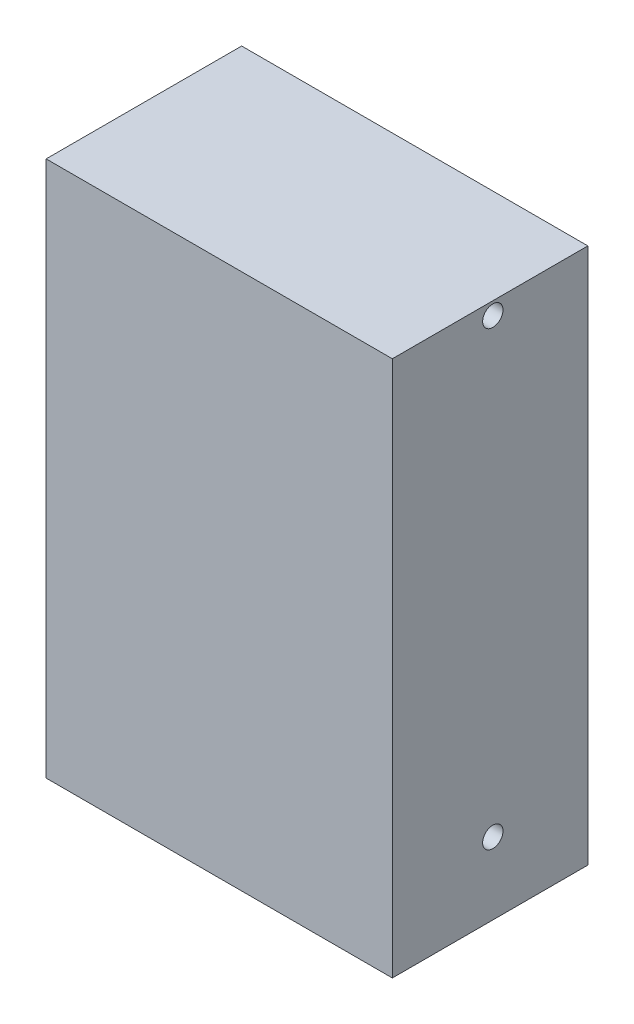
ISO-10303-21;
HEADER;
FILE_DESCRIPTION(('STEP AP214'),'2;1');
FILE_NAME('part.step','',(''),(''),'','','');
FILE_SCHEMA(('AUTOMOTIVE_DESIGN { 1 0 10303 214 1 1 1 1 }'));
ENDSEC;
DATA;
#1=APPLICATION_CONTEXT('core data for automotive mechanical design processes');
#2=APPLICATION_PROTOCOL_DEFINITION('international standard','automotive_design',2000,#1);
#3=PRODUCT_CONTEXT('',#1,'mechanical');
#4=PRODUCT('Part','Part','',(#3));
#5=PRODUCT_RELATED_PRODUCT_CATEGORY('part','',(#4));
#6=PRODUCT_DEFINITION_FORMATION('','',#4);
#7=PRODUCT_DEFINITION_CONTEXT('part definition',#1,'design');
#8=PRODUCT_DEFINITION('design','',#6,#7);
#9=PRODUCT_DEFINITION_SHAPE('','',#8);
#10=(LENGTH_UNIT() NAMED_UNIT(*) SI_UNIT(.MILLI.,.METRE.));
#11=(NAMED_UNIT(*) PLANE_ANGLE_UNIT() SI_UNIT($,.RADIAN.));
#12=(NAMED_UNIT(*) SI_UNIT($,.STERADIAN.) SOLID_ANGLE_UNIT());
#13=UNCERTAINTY_MEASURE_WITH_UNIT(LENGTH_MEASURE(1.E-05),#10,'distance_accuracy_value','');
#14=(GEOMETRIC_REPRESENTATION_CONTEXT(3) GLOBAL_UNCERTAINTY_ASSIGNED_CONTEXT((#13)) GLOBAL_UNIT_ASSIGNED_CONTEXT((#10,
#11,#12)) REPRESENTATION_CONTEXT('',''));
#15=CARTESIAN_POINT('',(0.,0.,0.));
#16=DIRECTION('',(0.,0.,1.));
#17=DIRECTION('',(1.,0.,0.));
#18=AXIS2_PLACEMENT_3D('',#15,#16,#17);
#19=CARTESIAN_POINT('',(25.5,39.5,28.8));
#20=DIRECTION('',(-1.,0.,0.));
#21=DIRECTION('',(0.,-1.,0.));
#22=AXIS2_PLACEMENT_3D('',#19,#20,#21);
#23=PLANE('',#22);
#24=CARTESIAN_POINT('',(25.5,-28.9,14.));
#25=DIRECTION('',(1.,0.,0.));
#26=DIRECTION('',(0.,1.,0.));
#27=AXIS2_PLACEMENT_3D('',#24,#25,#26);
#28=CIRCLE('',#27,1.5);
#29=CARTESIAN_POINT('',(25.5,-27.4,14.));
#30=VERTEX_POINT('',#29);
#31=EDGE_CURVE('E138',#30,#30,#28,.T.);
#32=ORIENTED_EDGE('',*,*,#31,.F.);
#33=EDGE_LOOP('',(#32));
#34=FACE_BOUND('',#33,.T.);
#35=CARTESIAN_POINT('',(25.5,37.6,14.));
#36=DIRECTION('',(1.,0.,0.));
#37=DIRECTION('',(0.,1.,0.));
#38=AXIS2_PLACEMENT_3D('',#35,#36,#37);
#39=CIRCLE('',#38,1.5);
#40=CARTESIAN_POINT('',(25.5,39.1,14.));
#41=VERTEX_POINT('',#40);
#42=EDGE_CURVE('E137',#41,#41,#39,.T.);
#43=ORIENTED_EDGE('',*,*,#42,.F.);
#44=EDGE_LOOP('',(#43));
#45=FACE_BOUND('',#44,.T.);
#46=DIRECTION('',(0.,1.,0.));
#47=VECTOR('',#46,1.);
#48=CARTESIAN_POINT('',(25.5,39.5,0.));
#49=LINE('',#48,#47);
#50=CARTESIAN_POINT('',(25.5,-39.5,0.));
#51=VERTEX_POINT('',#50);
#52=CARTESIAN_POINT('',(25.5,39.5,0.));
#53=VERTEX_POINT('',#52);
#54=EDGE_CURVE('E157',#51,#53,#49,.T.);
#55=ORIENTED_EDGE('',*,*,#54,.T.);
#56=DIRECTION('',(0.,0.,-1.));
#57=VECTOR('',#56,1.);
#58=CARTESIAN_POINT('',(25.5,39.5,28.8));
#59=LINE('',#58,#57);
#60=CARTESIAN_POINT('',(25.5,39.5,28.8));
#61=VERTEX_POINT('',#60);
#62=EDGE_CURVE('E11',#61,#53,#59,.T.);
#63=ORIENTED_EDGE('',*,*,#62,.F.);
#64=DIRECTION('',(0.,1.,0.));
#65=VECTOR('',#64,1.);
#66=CARTESIAN_POINT('',(25.5,39.5,28.8));
#67=LINE('',#66,#65);
#68=CARTESIAN_POINT('',(25.5,-39.5,28.8));
#69=VERTEX_POINT('',#68);
#70=EDGE_CURVE('E160',#69,#61,#67,.T.);
#71=ORIENTED_EDGE('',*,*,#70,.F.);
#72=DIRECTION('',(0.,0.,-1.));
#73=VECTOR('',#72,1.);
#74=CARTESIAN_POINT('',(25.5,-39.5,28.8));
#75=LINE('',#74,#73);
#76=EDGE_CURVE('E166',#69,#51,#75,.T.);
#77=ORIENTED_EDGE('',*,*,#76,.T.);
#78=EDGE_LOOP('',(#55,#63,#71,#77));
#79=FACE_BOUND('',#78,.T.);
#80=ADVANCED_FACE('F34',(#34,#45,#79),#23,.F.);
#81=CARTESIAN_POINT('',(-25.5,39.5,28.8));
#82=DIRECTION('',(0.,-1.,0.));
#83=DIRECTION('',(0.,0.,-1.));
#84=AXIS2_PLACEMENT_3D('',#81,#82,#83);
#85=PLANE('',#84);
#86=DIRECTION('',(-1.,0.,0.));
#87=VECTOR('',#86,1.);
#88=CARTESIAN_POINT('',(-25.5,39.5,0.));
#89=LINE('',#88,#87);
#90=CARTESIAN_POINT('',(-25.5,39.5,0.));
#91=VERTEX_POINT('',#90);
#92=EDGE_CURVE('E169',#53,#91,#89,.T.);
#93=ORIENTED_EDGE('',*,*,#92,.T.);
#94=DIRECTION('',(0.,0.,-1.));
#95=VECTOR('',#94,1.);
#96=CARTESIAN_POINT('',(-25.5,39.5,28.8));
#97=LINE('',#96,#95);
#98=CARTESIAN_POINT('',(-25.5,39.5,28.8));
#99=VERTEX_POINT('',#98);
#100=EDGE_CURVE('E41',#99,#91,#97,.T.);
#101=ORIENTED_EDGE('',*,*,#100,.F.);
#102=DIRECTION('',(-1.,0.,0.));
#103=VECTOR('',#102,1.);
#104=CARTESIAN_POINT('',(-25.5,39.5,28.8));
#105=LINE('',#104,#103);
#106=EDGE_CURVE('E84',#61,#99,#105,.T.);
#107=ORIENTED_EDGE('',*,*,#106,.F.);
#108=ORIENTED_EDGE('',*,*,#62,.T.);
#109=EDGE_LOOP('',(#93,#101,#107,#108));
#110=FACE_BOUND('',#109,.T.);
#111=ADVANCED_FACE('F212',(#110),#85,.F.);
#112=CARTESIAN_POINT('',(-25.5,39.5,28.8));
#113=DIRECTION('',(1.,0.,0.));
#114=DIRECTION('',(0.,1.,0.));
#115=AXIS2_PLACEMENT_3D('',#112,#113,#114);
#116=PLANE('',#115);
#117=DIRECTION('',(0.,0.,-1.));
#118=VECTOR('',#117,1.);
#119=CARTESIAN_POINT('',(-25.5,-34.5,17.));
#120=LINE('',#119,#118);
#121=CARTESIAN_POINT('',(-25.5,-34.5,17.));
#122=VERTEX_POINT('',#121);
#123=CARTESIAN_POINT('',(-25.5,-34.5,5.));
#124=VERTEX_POINT('',#123);
#125=EDGE_CURVE('E113',#122,#124,#120,.T.);
#126=ORIENTED_EDGE('',*,*,#125,.F.);
#127=DIRECTION('',(0.,-1.,0.));
#128=VECTOR('',#127,1.);
#129=CARTESIAN_POINT('',(-25.5,-34.5,17.));
#130=LINE('',#129,#128);
#131=CARTESIAN_POINT('',(-25.5,-39.5,17.));
#132=VERTEX_POINT('',#131);
#133=EDGE_CURVE('E141',#122,#132,#130,.T.);
#134=ORIENTED_EDGE('',*,*,#133,.T.);
#135=DIRECTION('',(0.,0.,-1.));
#136=VECTOR('',#135,1.);
#137=CARTESIAN_POINT('',(-25.5,-39.5,28.8));
#138=LINE('',#137,#136);
#139=CARTESIAN_POINT('',(-25.5,-39.5,28.8));
#140=VERTEX_POINT('',#139);
#141=EDGE_CURVE('E175',#140,#132,#138,.T.);
#142=ORIENTED_EDGE('',*,*,#141,.F.);
#143=DIRECTION('',(0.,-1.,0.));
#144=VECTOR('',#143,1.);
#145=CARTESIAN_POINT('',(-25.5,39.5,28.8));
#146=LINE('',#145,#144);
#147=EDGE_CURVE('E163',#99,#140,#146,.T.);
#148=ORIENTED_EDGE('',*,*,#147,.F.);
#149=ORIENTED_EDGE('',*,*,#100,.T.);
#150=DIRECTION('',(0.,-1.,0.));
#151=VECTOR('',#150,1.);
#152=CARTESIAN_POINT('',(-25.5,39.5,0.));
#153=LINE('',#152,#151);
#154=CARTESIAN_POINT('',(-25.5,-39.5,0.));
#155=VERTEX_POINT('',#154);
#156=EDGE_CURVE('E171',#91,#155,#153,.T.);
#157=ORIENTED_EDGE('',*,*,#156,.T.);
#158=CARTESIAN_POINT('',(-25.5,-39.5,5.));
#159=VERTEX_POINT('',#158);
#160=EDGE_CURVE('E127',#159,#155,#138,.T.);
#161=ORIENTED_EDGE('',*,*,#160,.F.);
#162=DIRECTION('',(0.,-1.,0.));
#163=VECTOR('',#162,1.);
#164=CARTESIAN_POINT('',(-25.5,-34.5,5.));
#165=LINE('',#164,#163);
#166=EDGE_CURVE('E48',#124,#159,#165,.T.);
#167=ORIENTED_EDGE('',*,*,#166,.F.);
#168=EDGE_LOOP('',(#126,#134,#142,#148,#149,#157,#161,#167));
#169=FACE_BOUND('',#168,.T.);
#170=ADVANCED_FACE('F125',(#169),#116,.F.);
#171=CARTESIAN_POINT('',(-25.5,-39.5,28.8));
#172=DIRECTION('',(0.,1.,0.));
#173=DIRECTION('',(0.,0.,1.));
#174=AXIS2_PLACEMENT_3D('',#171,#172,#173);
#175=PLANE('',#174);
#176=ORIENTED_EDGE('',*,*,#141,.T.);
#177=DIRECTION('',(-1.,0.,0.));
#178=VECTOR('',#177,1.);
#179=CARTESIAN_POINT('',(-25.5,-39.5,17.));
#180=LINE('',#179,#178);
#181=CARTESIAN_POINT('',(15.5,-39.5,17.));
#182=VERTEX_POINT('',#181);
#183=EDGE_CURVE('E122',#182,#132,#180,.T.);
#184=ORIENTED_EDGE('',*,*,#183,.F.);
#185=DIRECTION('',(0.,0.,1.));
#186=VECTOR('',#185,1.);
#187=CARTESIAN_POINT('',(15.5,-39.5,17.));
#188=LINE('',#187,#186);
#189=CARTESIAN_POINT('',(15.5,-39.5,5.));
#190=VERTEX_POINT('',#189);
#191=EDGE_CURVE('E194',#190,#182,#188,.T.);
#192=ORIENTED_EDGE('',*,*,#191,.F.);
#193=DIRECTION('',(1.,0.,0.));
#194=VECTOR('',#193,1.);
#195=CARTESIAN_POINT('',(-25.5,-39.5,5.));
#196=LINE('',#195,#194);
#197=EDGE_CURVE('E197',#159,#190,#196,.T.);
#198=ORIENTED_EDGE('',*,*,#197,.F.);
#199=ORIENTED_EDGE('',*,*,#160,.T.);
#200=DIRECTION('',(1.,0.,0.));
#201=VECTOR('',#200,1.);
#202=CARTESIAN_POINT('',(-25.5,-39.5,0.));
#203=LINE('',#202,#201);
#204=EDGE_CURVE('E77',#155,#51,#203,.T.);
#205=ORIENTED_EDGE('',*,*,#204,.T.);
#206=ORIENTED_EDGE('',*,*,#76,.F.);
#207=DIRECTION('',(1.,0.,0.));
#208=VECTOR('',#207,1.);
#209=CARTESIAN_POINT('',(-25.5,-39.5,28.8));
#210=LINE('',#209,#208);
#211=EDGE_CURVE('E57',#140,#69,#210,.T.);
#212=ORIENTED_EDGE('',*,*,#211,.F.);
#213=EDGE_LOOP('',(#176,#184,#192,#198,#199,#205,#206,#212));
#214=FACE_BOUND('',#213,.T.);
#215=ADVANCED_FACE('F187',(#214),#175,.F.);
#216=CARTESIAN_POINT('',(0.,0.,28.8));
#217=DIRECTION('',(0.,0.,1.));
#218=DIRECTION('',(1.,0.,0.));
#219=AXIS2_PLACEMENT_3D('',#216,#217,#218);
#220=PLANE('',#219);
#221=ORIENTED_EDGE('',*,*,#70,.T.);
#222=ORIENTED_EDGE('',*,*,#106,.T.);
#223=ORIENTED_EDGE('',*,*,#147,.T.);
#224=ORIENTED_EDGE('',*,*,#211,.T.);
#225=EDGE_LOOP('',(#221,#222,#223,#224));
#226=FACE_BOUND('',#225,.T.);
#227=ADVANCED_FACE('F252',(#226),#220,.T.);
#228=CARTESIAN_POINT('',(0.,0.,0.));
#229=DIRECTION('',(0.,0.,1.));
#230=DIRECTION('',(1.,0.,0.));
#231=AXIS2_PLACEMENT_3D('',#228,#229,#230);
#232=PLANE('',#231);
#233=CARTESIAN_POINT('',(0.,-26.,0.));
#234=DIRECTION('',(0.,0.,-1.));
#235=DIRECTION('',(-1.,0.,0.));
#236=AXIS2_PLACEMENT_3D('',#233,#234,#235);
#237=CIRCLE('',#236,1.5);
#238=CARTESIAN_POINT('',(-1.50000000000001,-26.,0.));
#239=VERTEX_POINT('',#238);
#240=EDGE_CURVE('E145',#239,#239,#237,.T.);
#241=ORIENTED_EDGE('',*,*,#240,.F.);
#242=EDGE_LOOP('',(#241));
#243=FACE_BOUND('',#242,.T.);
#244=CARTESIAN_POINT('',(0.,29.,0.));
#245=DIRECTION('',(0.,0.,-1.));
#246=DIRECTION('',(-1.,0.,0.));
#247=AXIS2_PLACEMENT_3D('',#244,#245,#246);
#248=CIRCLE('',#247,1.5);
#249=CARTESIAN_POINT('',(-1.5,29.,0.));
#250=VERTEX_POINT('',#249);
#251=EDGE_CURVE('E151',#250,#250,#248,.T.);
#252=ORIENTED_EDGE('',*,*,#251,.F.);
#253=EDGE_LOOP('',(#252));
#254=FACE_BOUND('',#253,.T.);
#255=ORIENTED_EDGE('',*,*,#54,.F.);
#256=ORIENTED_EDGE('',*,*,#204,.F.);
#257=ORIENTED_EDGE('',*,*,#156,.F.);
#258=ORIENTED_EDGE('',*,*,#92,.F.);
#259=EDGE_LOOP('',(#255,#256,#257,#258));
#260=FACE_BOUND('',#259,.T.);
#261=ADVANCED_FACE('F183',(#243,#254,#260),#232,.F.);
#262=CARTESIAN_POINT('',(0.,29.,5.));
#263=DIRECTION('',(0.,0.,-1.));
#264=DIRECTION('',(-1.,0.,0.));
#265=AXIS2_PLACEMENT_3D('',#262,#263,#264);
#266=CYLINDRICAL_SURFACE('',#265,1.5);
#267=CARTESIAN_POINT('',(0.,29.,5.));
#268=DIRECTION('',(0.,0.,-1.));
#269=DIRECTION('',(-1.,0.,0.));
#270=AXIS2_PLACEMENT_3D('',#267,#268,#269);
#271=CIRCLE('',#270,1.5);
#272=CARTESIAN_POINT('',(-1.5,29.,5.));
#273=VERTEX_POINT('',#272);
#274=EDGE_CURVE('E154',#273,#273,#271,.T.);
#275=ORIENTED_EDGE('',*,*,#274,.F.);
#276=EDGE_LOOP('',(#275));
#277=FACE_BOUND('',#276,.T.);
#278=ORIENTED_EDGE('',*,*,#251,.T.);
#279=EDGE_LOOP('',(#278));
#280=FACE_BOUND('',#279,.T.);
#281=ADVANCED_FACE('F247',(#277,#280),#266,.F.);
#282=CARTESIAN_POINT('',(0.,29.,5.));
#283=DIRECTION('',(0.,0.,-1.));
#284=DIRECTION('',(-1.,0.,0.));
#285=AXIS2_PLACEMENT_3D('',#282,#283,#284);
#286=PLANE('',#285);
#287=ORIENTED_EDGE('',*,*,#274,.T.);
#288=EDGE_LOOP('',(#287));
#289=FACE_BOUND('',#288,.T.);
#290=ADVANCED_FACE('F243',(#289),#286,.T.);
#291=CARTESIAN_POINT('',(0.,-26.,5.));
#292=DIRECTION('',(0.,0.,-1.));
#293=DIRECTION('',(-1.,0.,0.));
#294=AXIS2_PLACEMENT_3D('',#291,#292,#293);
#295=CYLINDRICAL_SURFACE('',#294,1.5);
#296=CARTESIAN_POINT('',(0.,-26.,5.));
#297=DIRECTION('',(0.,0.,-1.));
#298=DIRECTION('',(-1.,0.,0.));
#299=AXIS2_PLACEMENT_3D('',#296,#297,#298);
#300=CIRCLE('',#299,1.5);
#301=CARTESIAN_POINT('',(-1.50000000000001,-26.,5.));
#302=VERTEX_POINT('',#301);
#303=EDGE_CURVE('E148',#302,#302,#300,.T.);
#304=ORIENTED_EDGE('',*,*,#303,.F.);
#305=EDGE_LOOP('',(#304));
#306=FACE_BOUND('',#305,.T.);
#307=ORIENTED_EDGE('',*,*,#240,.T.);
#308=EDGE_LOOP('',(#307));
#309=FACE_BOUND('',#308,.T.);
#310=ADVANCED_FACE('F235',(#306,#309),#295,.F.);
#311=CARTESIAN_POINT('',(0.,-26.,5.));
#312=DIRECTION('',(0.,0.,-1.));
#313=DIRECTION('',(-1.,0.,0.));
#314=AXIS2_PLACEMENT_3D('',#311,#312,#313);
#315=PLANE('',#314);
#316=ORIENTED_EDGE('',*,*,#303,.T.);
#317=EDGE_LOOP('',(#316));
#318=FACE_BOUND('',#317,.T.);
#319=ADVANCED_FACE('F226',(#318),#315,.T.);
#320=CARTESIAN_POINT('',(20.5,37.6,14.));
#321=DIRECTION('',(1.,0.,0.));
#322=DIRECTION('',(0.,1.,0.));
#323=AXIS2_PLACEMENT_3D('',#320,#321,#322);
#324=CYLINDRICAL_SURFACE('',#323,1.5);
#325=CARTESIAN_POINT('',(20.5,37.6,14.));
#326=DIRECTION('',(1.,0.,0.));
#327=DIRECTION('',(0.,1.,0.));
#328=AXIS2_PLACEMENT_3D('',#325,#326,#327);
#329=CIRCLE('',#328,1.5);
#330=CARTESIAN_POINT('',(20.5,39.1,14.));
#331=VERTEX_POINT('',#330);
#332=EDGE_CURVE('E142',#331,#331,#329,.T.);
#333=ORIENTED_EDGE('',*,*,#332,.F.);
#334=EDGE_LOOP('',(#333));
#335=FACE_BOUND('',#334,.T.);
#336=ORIENTED_EDGE('',*,*,#42,.T.);
#337=EDGE_LOOP('',(#336));
#338=FACE_BOUND('',#337,.T.);
#339=ADVANCED_FACE('F223',(#335,#338),#324,.F.);
#340=CARTESIAN_POINT('',(20.5,37.6,14.));
#341=DIRECTION('',(1.,0.,0.));
#342=DIRECTION('',(0.,1.,0.));
#343=AXIS2_PLACEMENT_3D('',#340,#341,#342);
#344=PLANE('',#343);
#345=ORIENTED_EDGE('',*,*,#332,.T.);
#346=EDGE_LOOP('',(#345));
#347=FACE_BOUND('',#346,.T.);
#348=ADVANCED_FACE('F225',(#347),#344,.T.);
#349=CARTESIAN_POINT('',(20.5,-28.9,14.));
#350=DIRECTION('',(1.,0.,0.));
#351=DIRECTION('',(0.,1.,0.));
#352=AXIS2_PLACEMENT_3D('',#349,#350,#351);
#353=CYLINDRICAL_SURFACE('',#352,1.5);
#354=CARTESIAN_POINT('',(20.5,-28.9,14.));
#355=DIRECTION('',(1.,0.,0.));
#356=DIRECTION('',(0.,1.,0.));
#357=AXIS2_PLACEMENT_3D('',#354,#355,#356);
#358=CIRCLE('',#357,1.5);
#359=CARTESIAN_POINT('',(20.5,-27.4,14.));
#360=VERTEX_POINT('',#359);
#361=EDGE_CURVE('E134',#360,#360,#358,.T.);
#362=ORIENTED_EDGE('',*,*,#361,.F.);
#363=EDGE_LOOP('',(#362));
#364=FACE_BOUND('',#363,.T.);
#365=ORIENTED_EDGE('',*,*,#31,.T.);
#366=EDGE_LOOP('',(#365));
#367=FACE_BOUND('',#366,.T.);
#368=ADVANCED_FACE('F232',(#364,#367),#353,.F.);
#369=CARTESIAN_POINT('',(20.5,-28.9,14.));
#370=DIRECTION('',(1.,0.,0.));
#371=DIRECTION('',(0.,1.,0.));
#372=AXIS2_PLACEMENT_3D('',#369,#370,#371);
#373=PLANE('',#372);
#374=ORIENTED_EDGE('',*,*,#361,.T.);
#375=EDGE_LOOP('',(#374));
#376=FACE_BOUND('',#375,.T.);
#377=ADVANCED_FACE('F209',(#376),#373,.T.);
#378=CARTESIAN_POINT('',(-25.5,-34.5,17.));
#379=DIRECTION('',(0.,0.,1.));
#380=DIRECTION('',(1.,0.,0.));
#381=AXIS2_PLACEMENT_3D('',#378,#379,#380);
#382=PLANE('',#381);
#383=ORIENTED_EDGE('',*,*,#183,.T.);
#384=ORIENTED_EDGE('',*,*,#133,.F.);
#385=DIRECTION('',(-1.,0.,0.));
#386=VECTOR('',#385,1.);
#387=CARTESIAN_POINT('',(-25.5,-34.5,17.));
#388=LINE('',#387,#386);
#389=CARTESIAN_POINT('',(15.5,-34.5,17.));
#390=VERTEX_POINT('',#389);
#391=EDGE_CURVE('E119',#390,#122,#388,.T.);
#392=ORIENTED_EDGE('',*,*,#391,.F.);
#393=DIRECTION('',(0.,-1.,0.));
#394=VECTOR('',#393,1.);
#395=CARTESIAN_POINT('',(15.5,-34.5,17.));
#396=LINE('',#395,#394);
#397=EDGE_CURVE('E129',#390,#182,#396,.T.);
#398=ORIENTED_EDGE('',*,*,#397,.T.);
#399=EDGE_LOOP('',(#383,#384,#392,#398));
#400=FACE_BOUND('',#399,.T.);
#401=ADVANCED_FACE('F200',(#400),#382,.F.);
#402=CARTESIAN_POINT('',(15.5,-34.5,17.));
#403=DIRECTION('',(1.,0.,0.));
#404=DIRECTION('',(0.,0.,-1.));
#405=AXIS2_PLACEMENT_3D('',#402,#403,#404);
#406=PLANE('',#405);
#407=ORIENTED_EDGE('',*,*,#191,.T.);
#408=ORIENTED_EDGE('',*,*,#397,.F.);
#409=DIRECTION('',(0.,0.,1.));
#410=VECTOR('',#409,1.);
#411=CARTESIAN_POINT('',(15.5,-34.5,17.));
#412=LINE('',#411,#410);
#413=CARTESIAN_POINT('',(15.5,-34.5,5.));
#414=VERTEX_POINT('',#413);
#415=EDGE_CURVE('E112',#414,#390,#412,.T.);
#416=ORIENTED_EDGE('',*,*,#415,.F.);
#417=DIRECTION('',(0.,-1.,0.));
#418=VECTOR('',#417,1.);
#419=CARTESIAN_POINT('',(15.5,-34.5,5.));
#420=LINE('',#419,#418);
#421=EDGE_CURVE('E108',#414,#190,#420,.T.);
#422=ORIENTED_EDGE('',*,*,#421,.T.);
#423=EDGE_LOOP('',(#407,#408,#416,#422));
#424=FACE_BOUND('',#423,.T.);
#425=ADVANCED_FACE('F201',(#424),#406,.F.);
#426=CARTESIAN_POINT('',(-25.5,-34.5,5.));
#427=DIRECTION('',(0.,0.,-1.));
#428=DIRECTION('',(-1.,0.,0.));
#429=AXIS2_PLACEMENT_3D('',#426,#427,#428);
#430=PLANE('',#429);
#431=ORIENTED_EDGE('',*,*,#197,.T.);
#432=ORIENTED_EDGE('',*,*,#421,.F.);
#433=DIRECTION('',(1.,0.,0.));
#434=VECTOR('',#433,1.);
#435=CARTESIAN_POINT('',(-25.5,-34.5,5.));
#436=LINE('',#435,#434);
#437=EDGE_CURVE('E105',#124,#414,#436,.T.);
#438=ORIENTED_EDGE('',*,*,#437,.F.);
#439=ORIENTED_EDGE('',*,*,#166,.T.);
#440=EDGE_LOOP('',(#431,#432,#438,#439));
#441=FACE_BOUND('',#440,.T.);
#442=ADVANCED_FACE('F107',(#441),#430,.F.);
#443=CARTESIAN_POINT('',(0.,-34.5,0.));
#444=DIRECTION('',(0.,-1.,0.));
#445=DIRECTION('',(0.,0.,-1.));
#446=AXIS2_PLACEMENT_3D('',#443,#444,#445);
#447=PLANE('',#446);
#448=ORIENTED_EDGE('',*,*,#125,.T.);
#449=ORIENTED_EDGE('',*,*,#437,.T.);
#450=ORIENTED_EDGE('',*,*,#415,.T.);
#451=ORIENTED_EDGE('',*,*,#391,.T.);
#452=EDGE_LOOP('',(#448,#449,#450,#451));
#453=FACE_BOUND('',#452,.T.);
#454=ADVANCED_FACE('F117',(#453),#447,.T.);
#455=CLOSED_SHELL('',(#80,#111,#170,#215,#227,#261,#281,#290,#310,#319,#339,#348,#368,#377,#401,
#425,#442,#454));
#456=MANIFOLD_SOLID_BREP('B2',#455);
#457=ADVANCED_BREP_SHAPE_REPRESENTATION('',(#18,#456),#14);
#458=SHAPE_DEFINITION_REPRESENTATION(#9,#457);
ENDSEC;
END-ISO-10303-21;
